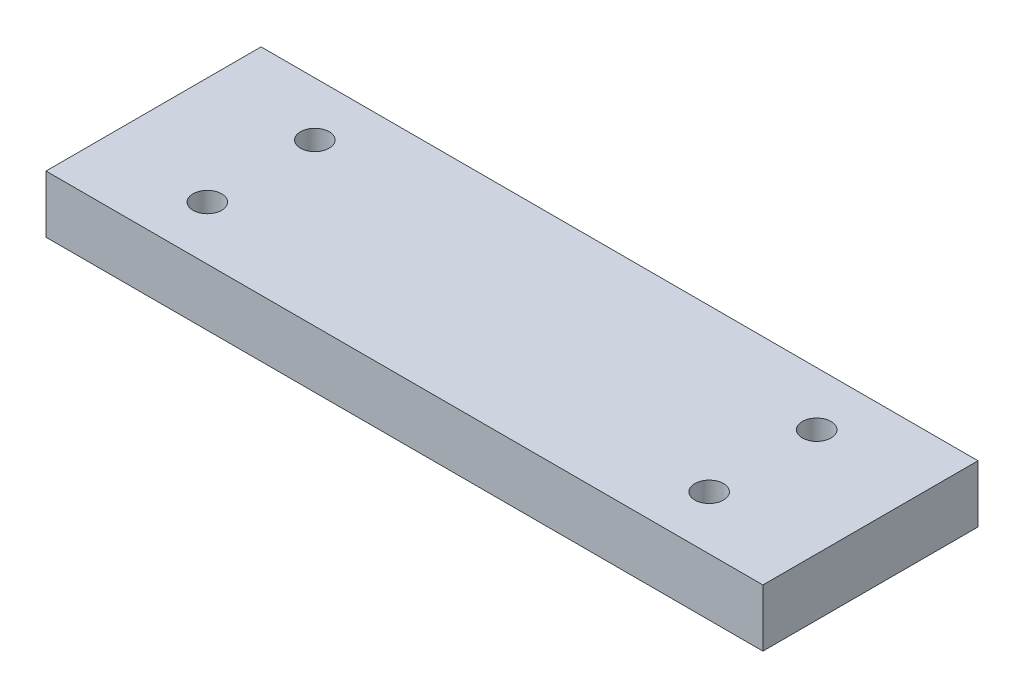
ISO-10303-21;
HEADER;
FILE_DESCRIPTION(('STEP AP214'),'2;1');
FILE_NAME('part.step','',(''),(''),'','','');
FILE_SCHEMA(('AUTOMOTIVE_DESIGN { 1 0 10303 214 1 1 1 1 }'));
ENDSEC;
DATA;
#1=APPLICATION_CONTEXT('core data for automotive mechanical design processes');
#2=APPLICATION_PROTOCOL_DEFINITION('international standard','automotive_design',2000,#1);
#3=PRODUCT_CONTEXT('',#1,'mechanical');
#4=PRODUCT('Part','Part','',(#3));
#5=PRODUCT_RELATED_PRODUCT_CATEGORY('part','',(#4));
#6=PRODUCT_DEFINITION_FORMATION('','',#4);
#7=PRODUCT_DEFINITION_CONTEXT('part definition',#1,'design');
#8=PRODUCT_DEFINITION('design','',#6,#7);
#9=PRODUCT_DEFINITION_SHAPE('','',#8);
#10=(LENGTH_UNIT() NAMED_UNIT(*) SI_UNIT(.MILLI.,.METRE.));
#11=(NAMED_UNIT(*) PLANE_ANGLE_UNIT() SI_UNIT($,.RADIAN.));
#12=(NAMED_UNIT(*) SI_UNIT($,.STERADIAN.) SOLID_ANGLE_UNIT());
#13=UNCERTAINTY_MEASURE_WITH_UNIT(LENGTH_MEASURE(1.E-05),#10,'distance_accuracy_value','');
#14=(GEOMETRIC_REPRESENTATION_CONTEXT(3) GLOBAL_UNCERTAINTY_ASSIGNED_CONTEXT((#13)) GLOBAL_UNIT_ASSIGNED_CONTEXT((#10,
#11,#12)) REPRESENTATION_CONTEXT('',''));
#15=CARTESIAN_POINT('',(0.,0.,0.));
#16=DIRECTION('',(0.,0.,1.));
#17=DIRECTION('',(1.,0.,0.));
#18=AXIS2_PLACEMENT_3D('',#15,#16,#17);
#19=CARTESIAN_POINT('',(0.,8.,0.));
#20=DIRECTION('',(0.,1.,0.));
#21=DIRECTION('',(0.,0.,1.));
#22=AXIS2_PLACEMENT_3D('',#19,#20,#21);
#23=PLANE('',#22);
#24=CARTESIAN_POINT('',(-35.,8.,7.50000000000003));
#25=DIRECTION('',(0.,1.,0.));
#26=DIRECTION('',(0.,0.,-1.));
#27=AXIS2_PLACEMENT_3D('',#24,#25,#26);
#28=CIRCLE('',#27,2.00000000000002);
#29=CARTESIAN_POINT('',(-35.,8.,5.50000000000002));
#30=VERTEX_POINT('',#29);
#31=EDGE_CURVE('E121',#30,#30,#28,.T.);
#32=ORIENTED_EDGE('',*,*,#31,.F.);
#33=EDGE_LOOP('',(#32));
#34=FACE_BOUND('',#33,.T.);
#35=CARTESIAN_POINT('',(35.,8.,-7.5));
#36=DIRECTION('',(0.,1.,0.));
#37=DIRECTION('',(0.,0.,1.));
#38=AXIS2_PLACEMENT_3D('',#35,#36,#37);
#39=CIRCLE('',#38,2.);
#40=CARTESIAN_POINT('',(35.,8.,-5.5));
#41=VERTEX_POINT('',#40);
#42=EDGE_CURVE('E100',#41,#41,#39,.T.);
#43=ORIENTED_EDGE('',*,*,#42,.F.);
#44=EDGE_LOOP('',(#43));
#45=FACE_BOUND('',#44,.T.);
#46=DIRECTION('',(0.,0.,-1.));
#47=VECTOR('',#46,1.);
#48=CARTESIAN_POINT('',(50.,8.,-15.));
#49=LINE('',#48,#47);
#50=CARTESIAN_POINT('',(50.,8.,15.));
#51=VERTEX_POINT('',#50);
#52=CARTESIAN_POINT('',(50.,8.,-15.));
#53=VERTEX_POINT('',#52);
#54=EDGE_CURVE('E85',#51,#53,#49,.T.);
#55=ORIENTED_EDGE('',*,*,#54,.T.);
#56=DIRECTION('',(-1.,0.,0.));
#57=VECTOR('',#56,1.);
#58=CARTESIAN_POINT('',(-50.,8.,-15.));
#59=LINE('',#58,#57);
#60=CARTESIAN_POINT('',(-50.,8.,-15.));
#61=VERTEX_POINT('',#60);
#62=EDGE_CURVE('E80',#53,#61,#59,.T.);
#63=ORIENTED_EDGE('',*,*,#62,.T.);
#64=DIRECTION('',(0.,0.,1.));
#65=VECTOR('',#64,1.);
#66=CARTESIAN_POINT('',(-50.,8.,-15.));
#67=LINE('',#66,#65);
#68=CARTESIAN_POINT('',(-50.,8.,15.));
#69=VERTEX_POINT('',#68);
#70=EDGE_CURVE('E83',#61,#69,#67,.T.);
#71=ORIENTED_EDGE('',*,*,#70,.T.);
#72=DIRECTION('',(1.,0.,0.));
#73=VECTOR('',#72,1.);
#74=CARTESIAN_POINT('',(-50.,8.,15.));
#75=LINE('',#74,#73);
#76=EDGE_CURVE('E50',#69,#51,#75,.T.);
#77=ORIENTED_EDGE('',*,*,#76,.T.);
#78=EDGE_LOOP('',(#55,#63,#71,#77));
#79=FACE_BOUND('',#78,.T.);
#80=CARTESIAN_POINT('',(35.,8.,7.5));
#81=DIRECTION('',(0.,1.,0.));
#82=DIRECTION('',(0.,0.,1.));
#83=AXIS2_PLACEMENT_3D('',#80,#81,#82);
#84=CIRCLE('',#83,2.);
#85=CARTESIAN_POINT('',(35.,8.,9.5));
#86=VERTEX_POINT('',#85);
#87=EDGE_CURVE('E115',#86,#86,#84,.T.);
#88=ORIENTED_EDGE('',*,*,#87,.F.);
#89=EDGE_LOOP('',(#88));
#90=FACE_BOUND('',#89,.T.);
#91=CARTESIAN_POINT('',(-35.,8.,-7.49999999999997));
#92=DIRECTION('',(0.,1.,0.));
#93=DIRECTION('',(0.,0.,-1.));
#94=AXIS2_PLACEMENT_3D('',#91,#92,#93);
#95=CIRCLE('',#94,2.00000000000002);
#96=CARTESIAN_POINT('',(-35.,8.,-9.49999999999998));
#97=VERTEX_POINT('',#96);
#98=EDGE_CURVE('E127',#97,#97,#95,.T.);
#99=ORIENTED_EDGE('',*,*,#98,.F.);
#100=EDGE_LOOP('',(#99));
#101=FACE_BOUND('',#100,.T.);
#102=ADVANCED_FACE('F33',(#34,#45,#79,#90,#101),#23,.T.);
#103=CARTESIAN_POINT('',(0.,0.,0.));
#104=DIRECTION('',(0.,1.,0.));
#105=DIRECTION('',(0.,0.,1.));
#106=AXIS2_PLACEMENT_3D('',#103,#104,#105);
#107=PLANE('',#106);
#108=DIRECTION('',(0.,0.,-1.));
#109=VECTOR('',#108,1.);
#110=CARTESIAN_POINT('',(50.,0.,-15.));
#111=LINE('',#110,#109);
#112=CARTESIAN_POINT('',(50.,0.,15.));
#113=VERTEX_POINT('',#112);
#114=CARTESIAN_POINT('',(50.,0.,-15.));
#115=VERTEX_POINT('',#114);
#116=EDGE_CURVE('E97',#113,#115,#111,.T.);
#117=ORIENTED_EDGE('',*,*,#116,.F.);
#118=DIRECTION('',(1.,0.,0.));
#119=VECTOR('',#118,1.);
#120=CARTESIAN_POINT('',(-50.,0.,15.));
#121=LINE('',#120,#119);
#122=CARTESIAN_POINT('',(-50.,0.,15.));
#123=VERTEX_POINT('',#122);
#124=EDGE_CURVE('E73',#123,#113,#121,.T.);
#125=ORIENTED_EDGE('',*,*,#124,.F.);
#126=DIRECTION('',(0.,0.,1.));
#127=VECTOR('',#126,1.);
#128=CARTESIAN_POINT('',(-50.,0.,-15.));
#129=LINE('',#128,#127);
#130=CARTESIAN_POINT('',(-50.,0.,-15.));
#131=VERTEX_POINT('',#130);
#132=EDGE_CURVE('E67',#131,#123,#129,.T.);
#133=ORIENTED_EDGE('',*,*,#132,.F.);
#134=DIRECTION('',(-1.,0.,0.));
#135=VECTOR('',#134,1.);
#136=CARTESIAN_POINT('',(-50.,0.,-15.));
#137=LINE('',#136,#135);
#138=EDGE_CURVE('E89',#115,#131,#137,.T.);
#139=ORIENTED_EDGE('',*,*,#138,.F.);
#140=EDGE_LOOP('',(#117,#125,#133,#139));
#141=FACE_BOUND('',#140,.T.);
#142=CARTESIAN_POINT('',(35.,0.,-7.5));
#143=DIRECTION('',(0.,1.,0.));
#144=DIRECTION('',(0.,0.,1.));
#145=AXIS2_PLACEMENT_3D('',#142,#143,#144);
#146=CIRCLE('',#145,2.);
#147=CARTESIAN_POINT('',(35.,0.,-5.5));
#148=VERTEX_POINT('',#147);
#149=EDGE_CURVE('E112',#148,#148,#146,.T.);
#150=ORIENTED_EDGE('',*,*,#149,.T.);
#151=EDGE_LOOP('',(#150));
#152=FACE_BOUND('',#151,.T.);
#153=CARTESIAN_POINT('',(35.,0.,7.5));
#154=DIRECTION('',(0.,1.,0.));
#155=DIRECTION('',(0.,0.,1.));
#156=AXIS2_PLACEMENT_3D('',#153,#154,#155);
#157=CIRCLE('',#156,2.);
#158=CARTESIAN_POINT('',(35.,0.,9.5));
#159=VERTEX_POINT('',#158);
#160=EDGE_CURVE('E118',#159,#159,#157,.T.);
#161=ORIENTED_EDGE('',*,*,#160,.T.);
#162=EDGE_LOOP('',(#161));
#163=FACE_BOUND('',#162,.T.);
#164=CARTESIAN_POINT('',(-35.,0.,7.50000000000003));
#165=DIRECTION('',(0.,1.,0.));
#166=DIRECTION('',(0.,0.,-1.));
#167=AXIS2_PLACEMENT_3D('',#164,#165,#166);
#168=CIRCLE('',#167,2.00000000000002);
#169=CARTESIAN_POINT('',(-35.,0.,5.50000000000002));
#170=VERTEX_POINT('',#169);
#171=EDGE_CURVE('E124',#170,#170,#168,.T.);
#172=ORIENTED_EDGE('',*,*,#171,.T.);
#173=EDGE_LOOP('',(#172));
#174=FACE_BOUND('',#173,.T.);
#175=CARTESIAN_POINT('',(-35.,0.,-7.49999999999997));
#176=DIRECTION('',(0.,1.,0.));
#177=DIRECTION('',(0.,0.,-1.));
#178=AXIS2_PLACEMENT_3D('',#175,#176,#177);
#179=CIRCLE('',#178,2.00000000000002);
#180=CARTESIAN_POINT('',(-35.,0.,-9.49999999999998));
#181=VERTEX_POINT('',#180);
#182=EDGE_CURVE('E130',#181,#181,#179,.T.);
#183=ORIENTED_EDGE('',*,*,#182,.T.);
#184=EDGE_LOOP('',(#183));
#185=FACE_BOUND('',#184,.T.);
#186=ADVANCED_FACE('F108',(#141,#152,#163,#174,#185),#107,.F.);
#187=CARTESIAN_POINT('',(50.,8.,-15.));
#188=DIRECTION('',(-1.,0.,0.));
#189=DIRECTION('',(0.,0.,1.));
#190=AXIS2_PLACEMENT_3D('',#187,#188,#189);
#191=PLANE('',#190);
#192=ORIENTED_EDGE('',*,*,#116,.T.);
#193=DIRECTION('',(0.,-1.,0.));
#194=VECTOR('',#193,1.);
#195=CARTESIAN_POINT('',(50.,8.,-15.));
#196=LINE('',#195,#194);
#197=EDGE_CURVE('E11',#53,#115,#196,.T.);
#198=ORIENTED_EDGE('',*,*,#197,.F.);
#199=ORIENTED_EDGE('',*,*,#54,.F.);
#200=DIRECTION('',(0.,-1.,0.));
#201=VECTOR('',#200,1.);
#202=CARTESIAN_POINT('',(50.,8.,15.));
#203=LINE('',#202,#201);
#204=EDGE_CURVE('E93',#51,#113,#203,.T.);
#205=ORIENTED_EDGE('',*,*,#204,.T.);
#206=EDGE_LOOP('',(#192,#198,#199,#205));
#207=FACE_BOUND('',#206,.T.);
#208=ADVANCED_FACE('F35',(#207),#191,.F.);
#209=CARTESIAN_POINT('',(-50.,8.,-15.));
#210=DIRECTION('',(0.,0.,1.));
#211=DIRECTION('',(1.,0.,0.));
#212=AXIS2_PLACEMENT_3D('',#209,#210,#211);
#213=PLANE('',#212);
#214=ORIENTED_EDGE('',*,*,#138,.T.);
#215=DIRECTION('',(0.,-1.,0.));
#216=VECTOR('',#215,1.);
#217=CARTESIAN_POINT('',(-50.,8.,-15.));
#218=LINE('',#217,#216);
#219=EDGE_CURVE('E42',#61,#131,#218,.T.);
#220=ORIENTED_EDGE('',*,*,#219,.F.);
#221=ORIENTED_EDGE('',*,*,#62,.F.);
#222=ORIENTED_EDGE('',*,*,#197,.T.);
#223=EDGE_LOOP('',(#214,#220,#221,#222));
#224=FACE_BOUND('',#223,.T.);
#225=ADVANCED_FACE('F88',(#224),#213,.F.);
#226=CARTESIAN_POINT('',(-50.,8.,-15.));
#227=DIRECTION('',(1.,0.,0.));
#228=DIRECTION('',(0.,0.,-1.));
#229=AXIS2_PLACEMENT_3D('',#226,#227,#228);
#230=PLANE('',#229);
#231=ORIENTED_EDGE('',*,*,#132,.T.);
#232=DIRECTION('',(0.,-1.,0.));
#233=VECTOR('',#232,1.);
#234=CARTESIAN_POINT('',(-50.,8.,15.));
#235=LINE('',#234,#233);
#236=EDGE_CURVE('E90',#69,#123,#235,.T.);
#237=ORIENTED_EDGE('',*,*,#236,.F.);
#238=ORIENTED_EDGE('',*,*,#70,.F.);
#239=ORIENTED_EDGE('',*,*,#219,.T.);
#240=EDGE_LOOP('',(#231,#237,#238,#239));
#241=FACE_BOUND('',#240,.T.);
#242=ADVANCED_FACE('F91',(#241),#230,.F.);
#243=CARTESIAN_POINT('',(-50.,8.,15.));
#244=DIRECTION('',(0.,0.,-1.));
#245=DIRECTION('',(-1.,0.,0.));
#246=AXIS2_PLACEMENT_3D('',#243,#244,#245);
#247=PLANE('',#246);
#248=ORIENTED_EDGE('',*,*,#124,.T.);
#249=ORIENTED_EDGE('',*,*,#204,.F.);
#250=ORIENTED_EDGE('',*,*,#76,.F.);
#251=ORIENTED_EDGE('',*,*,#236,.T.);
#252=EDGE_LOOP('',(#248,#249,#250,#251));
#253=FACE_BOUND('',#252,.T.);
#254=ADVANCED_FACE('F105',(#253),#247,.F.);
#255=CARTESIAN_POINT('',(35.,8.,-7.5));
#256=DIRECTION('',(0.,-1.,0.));
#257=DIRECTION('',(0.,0.,-1.));
#258=AXIS2_PLACEMENT_3D('',#255,#256,#257);
#259=CYLINDRICAL_SURFACE('',#258,2.);
#260=ORIENTED_EDGE('',*,*,#42,.T.);
#261=EDGE_LOOP('',(#260));
#262=FACE_BOUND('',#261,.T.);
#263=ORIENTED_EDGE('',*,*,#149,.F.);
#264=EDGE_LOOP('',(#263));
#265=FACE_BOUND('',#264,.T.);
#266=ADVANCED_FACE('F149',(#262,#265),#259,.F.);
#267=CARTESIAN_POINT('',(35.,8.,7.5));
#268=DIRECTION('',(0.,-1.,0.));
#269=DIRECTION('',(0.,0.,-1.));
#270=AXIS2_PLACEMENT_3D('',#267,#268,#269);
#271=CYLINDRICAL_SURFACE('',#270,2.);
#272=ORIENTED_EDGE('',*,*,#87,.T.);
#273=EDGE_LOOP('',(#272));
#274=FACE_BOUND('',#273,.T.);
#275=ORIENTED_EDGE('',*,*,#160,.F.);
#276=EDGE_LOOP('',(#275));
#277=FACE_BOUND('',#276,.T.);
#278=ADVANCED_FACE('F195',(#274,#277),#271,.F.);
#279=CARTESIAN_POINT('',(-35.,8.,7.50000000000003));
#280=DIRECTION('',(0.,-1.,0.));
#281=DIRECTION('',(0.,0.,-1.));
#282=AXIS2_PLACEMENT_3D('',#279,#280,#281);
#283=CYLINDRICAL_SURFACE('',#282,2.00000000000002);
#284=ORIENTED_EDGE('',*,*,#31,.T.);
#285=EDGE_LOOP('',(#284));
#286=FACE_BOUND('',#285,.T.);
#287=ORIENTED_EDGE('',*,*,#171,.F.);
#288=EDGE_LOOP('',(#287));
#289=FACE_BOUND('',#288,.T.);
#290=ADVANCED_FACE('F203',(#286,#289),#283,.F.);
#291=CARTESIAN_POINT('',(-35.,8.,-7.49999999999997));
#292=DIRECTION('',(0.,-1.,0.));
#293=DIRECTION('',(0.,0.,-1.));
#294=AXIS2_PLACEMENT_3D('',#291,#292,#293);
#295=CYLINDRICAL_SURFACE('',#294,2.00000000000002);
#296=ORIENTED_EDGE('',*,*,#98,.T.);
#297=EDGE_LOOP('',(#296));
#298=FACE_BOUND('',#297,.T.);
#299=ORIENTED_EDGE('',*,*,#182,.F.);
#300=EDGE_LOOP('',(#299));
#301=FACE_BOUND('',#300,.T.);
#302=ADVANCED_FACE('F136',(#298,#301),#295,.F.);
#303=CLOSED_SHELL('',(#102,#186,#208,#225,#242,#254,#266,#278,#290,#302));
#304=MANIFOLD_SOLID_BREP('B2',#303);
#305=ADVANCED_BREP_SHAPE_REPRESENTATION('',(#18,#304),#14);
#306=SHAPE_DEFINITION_REPRESENTATION(#9,#305);
ENDSEC;
END-ISO-10303-21;
